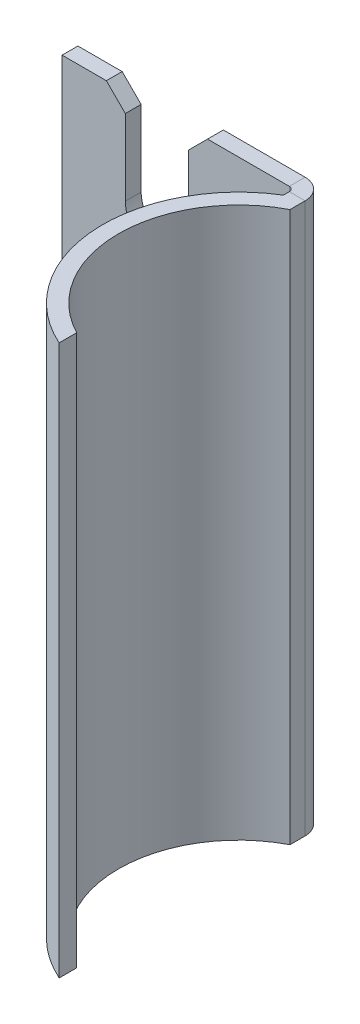
ISO-10303-21;
HEADER;
FILE_DESCRIPTION(('STEP AP214'),'2;1');
FILE_NAME('part.step','',(''),(''),'','','');
FILE_SCHEMA(('AUTOMOTIVE_DESIGN { 1 0 10303 214 1 1 1 1 }'));
ENDSEC;
DATA;
#1=APPLICATION_CONTEXT('core data for automotive mechanical design processes');
#2=APPLICATION_PROTOCOL_DEFINITION('international standard','automotive_design',2000,#1);
#3=PRODUCT_CONTEXT('',#1,'mechanical');
#4=PRODUCT('Part','Part','',(#3));
#5=PRODUCT_RELATED_PRODUCT_CATEGORY('part','',(#4));
#6=PRODUCT_DEFINITION_FORMATION('','',#4);
#7=PRODUCT_DEFINITION_CONTEXT('part definition',#1,'design');
#8=PRODUCT_DEFINITION('design','',#6,#7);
#9=PRODUCT_DEFINITION_SHAPE('','',#8);
#10=(LENGTH_UNIT() NAMED_UNIT(*) SI_UNIT(.MILLI.,.METRE.));
#11=(NAMED_UNIT(*) PLANE_ANGLE_UNIT() SI_UNIT($,.RADIAN.));
#12=(NAMED_UNIT(*) SI_UNIT($,.STERADIAN.) SOLID_ANGLE_UNIT());
#13=UNCERTAINTY_MEASURE_WITH_UNIT(LENGTH_MEASURE(1.E-05),#10,'distance_accuracy_value','');
#14=(GEOMETRIC_REPRESENTATION_CONTEXT(3) GLOBAL_UNCERTAINTY_ASSIGNED_CONTEXT((#13)) GLOBAL_UNIT_ASSIGNED_CONTEXT((#10,
#11,#12)) REPRESENTATION_CONTEXT('',''));
#15=CARTESIAN_POINT('',(0.,0.,0.));
#16=DIRECTION('',(0.,0.,1.));
#17=DIRECTION('',(1.,0.,0.));
#18=AXIS2_PLACEMENT_3D('',#15,#16,#17);
#19=CARTESIAN_POINT('',(39.1763280085947,-14.9999999948911,-23.3236719914054));
#20=DIRECTION('',(-1.,0.,0.));
#21=DIRECTION('',(0.,0.,1.));
#22=AXIS2_PLACEMENT_3D('',#19,#20,#21);
#23=PLANE('',#22);
#24=DIRECTION('',(0.,0.,1.));
#25=VECTOR('',#24,1.);
#26=CARTESIAN_POINT('',(39.1763280085948,-87.,-38.3236719914054));
#27=LINE('',#26,#25);
#28=CARTESIAN_POINT('',(39.1763280085946,-87.,0.736600000000011));
#29=VERTEX_POINT('',#28);
#30=CARTESIAN_POINT('',(39.1763280085946,-87.,3.13312362555544));
#31=VERTEX_POINT('',#30);
#32=EDGE_CURVE('E220',#29,#31,#27,.T.);
#33=ORIENTED_EDGE('',*,*,#32,.F.);
#34=DIRECTION('',(0.,1.,0.));
#35=VECTOR('',#34,1.);
#36=CARTESIAN_POINT('',(39.1763280085946,-14.9999999948911,0.736600000000018));
#37=LINE('',#36,#35);
#38=CARTESIAN_POINT('',(39.1763280085946,0.,0.736600000000041));
#39=VERTEX_POINT('',#38);
#40=EDGE_CURVE('E372',#29,#39,#37,.T.);
#41=ORIENTED_EDGE('',*,*,#40,.T.);
#42=DIRECTION('',(0.,0.,-1.));
#43=VECTOR('',#42,1.);
#44=CARTESIAN_POINT('',(39.1763280085947,0.,-18.3236719914054));
#45=LINE('',#44,#43);
#46=CARTESIAN_POINT('',(39.1763280085946,0.,3.13312362555544));
#47=VERTEX_POINT('',#46);
#48=EDGE_CURVE('E376',#47,#39,#45,.T.);
#49=ORIENTED_EDGE('',*,*,#48,.F.);
#50=DIRECTION('',(0.,1.,0.));
#51=VECTOR('',#50,1.);
#52=CARTESIAN_POINT('',(39.1763280085946,-127.04877857949,3.13312362555544));
#53=LINE('',#52,#51);
#54=EDGE_CURVE('E224',#31,#47,#53,.T.);
#55=ORIENTED_EDGE('',*,*,#54,.F.);
#56=EDGE_LOOP('',(#33,#41,#49,#55));
#57=FACE_BOUND('',#56,.T.);
#58=ADVANCED_FACE('F41',(#57),#23,.F.);
#59=CARTESIAN_POINT('',(39.1763280085947,0.,-18.3236719914054));
#60=DIRECTION('',(0.,1.,0.));
#61=DIRECTION('',(0.,0.,-1.));
#62=AXIS2_PLACEMENT_3D('',#59,#60,#61);
#63=PLANE('',#62);
#64=DIRECTION('',(1.,0.,0.));
#65=VECTOR('',#64,1.);
#66=CARTESIAN_POINT('',(39.1763280085946,0.,0.736600000000011));
#67=LINE('',#66,#65);
#68=CARTESIAN_POINT('',(36.6763280085946,0.,0.736600000000018));
#69=VERTEX_POINT('',#68);
#70=EDGE_CURVE('E382',#69,#39,#67,.T.);
#71=ORIENTED_EDGE('',*,*,#70,.F.);
#72=DIRECTION('',(0.,0.,-1.));
#73=VECTOR('',#72,1.);
#74=CARTESIAN_POINT('',(36.6763280085947,0.,-18.3236719914054));
#75=LINE('',#74,#73);
#76=CARTESIAN_POINT('',(36.6763280085946,0.,1.67632800859462));
#77=VERTEX_POINT('',#76);
#78=EDGE_CURVE('E371',#77,#69,#75,.T.);
#79=ORIENTED_EDGE('',*,*,#78,.F.);
#80=CARTESIAN_POINT('',(47.923240685031,0.,20.));
#81=DIRECTION('',(0.,1.,0.));
#82=DIRECTION('',(-1.,0.,0.));
#83=AXIS2_PLACEMENT_3D('',#80,#81,#82);
#84=CIRCLE('',#83,21.5);
#85=CARTESIAN_POINT('',(39.1763280085946,0.,39.6403034251204));
#86=VERTEX_POINT('',#85);
#87=EDGE_CURVE('E243',#77,#86,#84,.T.);
#88=ORIENTED_EDGE('',*,*,#87,.T.);
#89=DIRECTION('',(0.,0.,-1.));
#90=VECTOR('',#89,1.);
#91=CARTESIAN_POINT('',(39.1763280085946,0.,39.6403034251204));
#92=LINE('',#91,#90);
#93=CARTESIAN_POINT('',(39.1763280085946,0.,36.8668763744446));
#94=VERTEX_POINT('',#93);
#95=EDGE_CURVE('E239',#86,#94,#92,.T.);
#96=ORIENTED_EDGE('',*,*,#95,.T.);
#97=CARTESIAN_POINT('',(47.923240685031,0.,20.));
#98=DIRECTION('',(0.,-1.,0.));
#99=DIRECTION('',(-1.,0.,0.));
#100=AXIS2_PLACEMENT_3D('',#97,#98,#99);
#101=CIRCLE('',#100,19.);
#102=EDGE_CURVE('E230',#94,#47,#101,.T.);
#103=ORIENTED_EDGE('',*,*,#102,.T.);
#104=ORIENTED_EDGE('',*,*,#48,.T.);
#105=EDGE_LOOP('',(#71,#79,#88,#96,#103,#104));
#106=FACE_BOUND('',#105,.T.);
#107=ADVANCED_FACE('F486',(#106),#63,.T.);
#108=CARTESIAN_POINT('',(39.1763280085948,-87.,-38.3236719914054));
#109=DIRECTION('',(0.,-1.,0.));
#110=DIRECTION('',(1.,0.,0.));
#111=AXIS2_PLACEMENT_3D('',#108,#109,#110);
#112=PLANE('',#111);
#113=DIRECTION('',(-1.,0.,0.));
#114=VECTOR('',#113,1.);
#115=CARTESIAN_POINT('',(39.1763280085946,-87.,0.736600000000011));
#116=LINE('',#115,#114);
#117=CARTESIAN_POINT('',(36.6763280085946,-87.,0.736600000000004));
#118=VERTEX_POINT('',#117);
#119=EDGE_CURVE('E375',#29,#118,#116,.T.);
#120=ORIENTED_EDGE('',*,*,#119,.F.);
#121=ORIENTED_EDGE('',*,*,#32,.T.);
#122=CARTESIAN_POINT('',(47.923240685031,-87.,20.));
#123=DIRECTION('',(0.,-1.,0.));
#124=DIRECTION('',(0.,0.,-1.));
#125=AXIS2_PLACEMENT_3D('',#122,#123,#124);
#126=CIRCLE('',#125,19.);
#127=CARTESIAN_POINT('',(39.1763280085946,-87.,36.8668763744446));
#128=VERTEX_POINT('',#127);
#129=EDGE_CURVE('E212',#128,#31,#126,.T.);
#130=ORIENTED_EDGE('',*,*,#129,.F.);
#131=DIRECTION('',(0.,0.,-1.));
#132=VECTOR('',#131,1.);
#133=CARTESIAN_POINT('',(39.1763280085946,-87.,39.6403034251204));
#134=LINE('',#133,#132);
#135=CARTESIAN_POINT('',(39.1763280085946,-87.,39.6403034251204));
#136=VERTEX_POINT('',#135);
#137=EDGE_CURVE('E218',#136,#128,#134,.T.);
#138=ORIENTED_EDGE('',*,*,#137,.F.);
#139=CARTESIAN_POINT('',(47.923240685031,-87.,20.));
#140=DIRECTION('',(0.,-1.,0.));
#141=DIRECTION('',(0.,0.,-1.));
#142=AXIS2_PLACEMENT_3D('',#139,#140,#141);
#143=CIRCLE('',#142,21.5);
#144=CARTESIAN_POINT('',(36.6763280085946,-87.,1.67632800859462));
#145=VERTEX_POINT('',#144);
#146=EDGE_CURVE('E245',#145,#136,#143,.F.);
#147=ORIENTED_EDGE('',*,*,#146,.F.);
#148=DIRECTION('',(0.,0.,1.));
#149=VECTOR('',#148,1.);
#150=CARTESIAN_POINT('',(36.6763280085948,-87.,-38.3236719914054));
#151=LINE('',#150,#149);
#152=EDGE_CURVE('E264',#118,#145,#151,.T.);
#153=ORIENTED_EDGE('',*,*,#152,.F.);
#154=EDGE_LOOP('',(#120,#121,#130,#138,#147,#153));
#155=FACE_BOUND('',#154,.T.);
#156=ADVANCED_FACE('F215',(#155),#112,.T.);
#157=CARTESIAN_POINT('',(36.6763280085947,-14.9999999948911,-23.3236719914054));
#158=DIRECTION('',(-1.,0.,0.));
#159=DIRECTION('',(0.,0.,1.));
#160=AXIS2_PLACEMENT_3D('',#157,#158,#159);
#161=PLANE('',#160);
#162=DIRECTION('',(0.,1.,0.));
#163=VECTOR('',#162,1.);
#164=CARTESIAN_POINT('',(36.6763280085946,-14.9999999948911,0.736600000000011));
#165=LINE('',#164,#163);
#166=EDGE_CURVE('E379',#118,#69,#165,.T.);
#167=ORIENTED_EDGE('',*,*,#166,.F.);
#168=ORIENTED_EDGE('',*,*,#152,.T.);
#169=DIRECTION('',(0.,1.,0.));
#170=VECTOR('',#169,1.);
#171=CARTESIAN_POINT('',(36.6763280085946,0.,1.67632800859462));
#172=LINE('',#171,#170);
#173=EDGE_CURVE('E369',#145,#77,#172,.T.);
#174=ORIENTED_EDGE('',*,*,#173,.T.);
#175=ORIENTED_EDGE('',*,*,#78,.T.);
#176=EDGE_LOOP('',(#167,#168,#174,#175));
#177=FACE_BOUND('',#176,.T.);
#178=ADVANCED_FACE('F477',(#177),#161,.T.);
#179=CARTESIAN_POINT('',(20.,0.,-2.5));
#180=DIRECTION('',(-1.,0.,0.));
#181=DIRECTION('',(0.,-1.,0.));
#182=AXIS2_PLACEMENT_3D('',#179,#180,#181);
#183=PLANE('',#182);
#184=DIRECTION('',(0.,-1.,0.));
#185=VECTOR('',#184,1.);
#186=CARTESIAN_POINT('',(20.,0.,0.));
#187=LINE('',#186,#185);
#188=CARTESIAN_POINT('',(20.,-3.00000000000002,0.));
#189=VERTEX_POINT('',#188);
#190=CARTESIAN_POINT('',(20.,-15.,0.));
#191=VERTEX_POINT('',#190);
#192=EDGE_CURVE('E297',#189,#191,#187,.T.);
#193=ORIENTED_EDGE('',*,*,#192,.F.);
#194=DIRECTION('',(0.,0.,-1.));
#195=VECTOR('',#194,1.);
#196=CARTESIAN_POINT('',(20.,-3.00000000000002,-2.5));
#197=LINE('',#196,#195);
#198=CARTESIAN_POINT('',(20.,-3.00000000000002,-2.5));
#199=VERTEX_POINT('',#198);
#200=EDGE_CURVE('E404',#189,#199,#197,.T.);
#201=ORIENTED_EDGE('',*,*,#200,.T.);
#202=DIRECTION('',(0.,-1.,0.));
#203=VECTOR('',#202,1.);
#204=CARTESIAN_POINT('',(20.,0.,-2.5));
#205=LINE('',#204,#203);
#206=CARTESIAN_POINT('',(20.,-15.,-2.5));
#207=VERTEX_POINT('',#206);
#208=EDGE_CURVE('E366',#199,#207,#205,.T.);
#209=ORIENTED_EDGE('',*,*,#208,.T.);
#210=DIRECTION('',(0.,0.,1.));
#211=VECTOR('',#210,1.);
#212=CARTESIAN_POINT('',(20.,-15.,-2.5));
#213=LINE('',#212,#211);
#214=EDGE_CURVE('E363',#207,#191,#213,.T.);
#215=ORIENTED_EDGE('',*,*,#214,.T.);
#216=EDGE_LOOP('',(#193,#201,#209,#215));
#217=FACE_BOUND('',#216,.T.);
#218=ADVANCED_FACE('F500',(#217),#183,.T.);
#219=CARTESIAN_POINT('',(15.,-14.9999999948911,-2.5));
#220=DIRECTION('',(0.,0.,1.));
#221=DIRECTION('',(1.,0.,0.));
#222=AXIS2_PLACEMENT_3D('',#219,#220,#221);
#223=CYLINDRICAL_SURFACE('',#222,5.);
#224=CARTESIAN_POINT('',(15.,-14.9999999948911,0.));
#225=DIRECTION('',(0.,0.,-1.));
#226=DIRECTION('',(1.,0.,0.));
#227=AXIS2_PLACEMENT_3D('',#224,#225,#226);
#228=CIRCLE('',#227,5.);
#229=CARTESIAN_POINT('',(10.,-15.,0.));
#230=VERTEX_POINT('',#229);
#231=EDGE_CURVE('E294',#191,#230,#228,.T.);
#232=ORIENTED_EDGE('',*,*,#231,.F.);
#233=ORIENTED_EDGE('',*,*,#214,.F.);
#234=CARTESIAN_POINT('',(15.,-14.9999999948911,-2.5));
#235=DIRECTION('',(0.,0.,-1.));
#236=DIRECTION('',(1.,0.,0.));
#237=AXIS2_PLACEMENT_3D('',#234,#235,#236);
#238=CIRCLE('',#237,5.);
#239=CARTESIAN_POINT('',(10.,-15.,-2.5));
#240=VERTEX_POINT('',#239);
#241=EDGE_CURVE('E360',#207,#240,#238,.T.);
#242=ORIENTED_EDGE('',*,*,#241,.T.);
#243=DIRECTION('',(0.,0.,1.));
#244=VECTOR('',#243,1.);
#245=CARTESIAN_POINT('',(10.,-15.,-2.5));
#246=LINE('',#245,#244);
#247=EDGE_CURVE('E358',#240,#230,#246,.T.);
#248=ORIENTED_EDGE('',*,*,#247,.T.);
#249=EDGE_LOOP('',(#232,#233,#242,#248));
#250=FACE_BOUND('',#249,.T.);
#251=ADVANCED_FACE('F554',(#250),#223,.F.);
#252=CARTESIAN_POINT('',(9.99999999999999,0.,-2.5));
#253=DIRECTION('',(1.,0.,0.));
#254=DIRECTION('',(0.,0.,-1.));
#255=AXIS2_PLACEMENT_3D('',#252,#253,#254);
#256=PLANE('',#255);
#257=DIRECTION('',(0.,1.,0.));
#258=VECTOR('',#257,1.);
#259=CARTESIAN_POINT('',(9.99999999999999,0.,-2.5));
#260=LINE('',#259,#258);
#261=CARTESIAN_POINT('',(9.99999999999999,-3.,-2.5));
#262=VERTEX_POINT('',#261);
#263=EDGE_CURVE('E355',#240,#262,#260,.T.);
#264=ORIENTED_EDGE('',*,*,#263,.T.);
#265=DIRECTION('',(0.,0.,1.));
#266=VECTOR('',#265,1.);
#267=CARTESIAN_POINT('',(9.99999999999999,-3.,-2.5));
#268=LINE('',#267,#266);
#269=CARTESIAN_POINT('',(9.99999999999999,-3.,0.));
#270=VERTEX_POINT('',#269);
#271=EDGE_CURVE('E410',#262,#270,#268,.T.);
#272=ORIENTED_EDGE('',*,*,#271,.T.);
#273=DIRECTION('',(0.,1.,0.));
#274=VECTOR('',#273,1.);
#275=CARTESIAN_POINT('',(9.99999999999999,0.,0.));
#276=LINE('',#275,#274);
#277=EDGE_CURVE('E291',#230,#270,#276,.T.);
#278=ORIENTED_EDGE('',*,*,#277,.F.);
#279=ORIENTED_EDGE('',*,*,#247,.F.);
#280=EDGE_LOOP('',(#264,#272,#278,#279));
#281=FACE_BOUND('',#280,.T.);
#282=ADVANCED_FACE('F549',(#281),#256,.T.);
#283=CARTESIAN_POINT('',(0.,0.,-2.5));
#284=DIRECTION('',(0.,1.,0.));
#285=DIRECTION('',(-1.,0.,0.));
#286=AXIS2_PLACEMENT_3D('',#283,#284,#285);
#287=PLANE('',#286);
#288=DIRECTION('',(-1.,0.,0.));
#289=VECTOR('',#288,1.);
#290=CARTESIAN_POINT('',(0.,0.,0.));
#291=LINE('',#290,#289);
#292=CARTESIAN_POINT('',(6.99999999999998,0.,0.));
#293=VERTEX_POINT('',#292);
#294=CARTESIAN_POINT('',(0.,0.,0.));
#295=VERTEX_POINT('',#294);
#296=EDGE_CURVE('E289',#293,#295,#291,.T.);
#297=ORIENTED_EDGE('',*,*,#296,.F.);
#298=DIRECTION('',(0.,0.,-1.));
#299=VECTOR('',#298,1.);
#300=CARTESIAN_POINT('',(6.99999999999998,0.,-2.5));
#301=LINE('',#300,#299);
#302=CARTESIAN_POINT('',(6.99999999999998,0.,-2.5));
#303=VERTEX_POINT('',#302);
#304=EDGE_CURVE('E413',#293,#303,#301,.T.);
#305=ORIENTED_EDGE('',*,*,#304,.T.);
#306=DIRECTION('',(-1.,0.,0.));
#307=VECTOR('',#306,1.);
#308=CARTESIAN_POINT('',(0.,0.,-2.5));
#309=LINE('',#308,#307);
#310=CARTESIAN_POINT('',(0.,0.,-2.5));
#311=VERTEX_POINT('',#310);
#312=EDGE_CURVE('E353',#303,#311,#309,.T.);
#313=ORIENTED_EDGE('',*,*,#312,.T.);
#314=DIRECTION('',(0.,0.,1.));
#315=VECTOR('',#314,1.);
#316=CARTESIAN_POINT('',(0.,0.,-2.5));
#317=LINE('',#316,#315);
#318=EDGE_CURVE('E350',#311,#295,#317,.T.);
#319=ORIENTED_EDGE('',*,*,#318,.T.);
#320=EDGE_LOOP('',(#297,#305,#313,#319));
#321=FACE_BOUND('',#320,.T.);
#322=ADVANCED_FACE('F542',(#321),#287,.T.);
#323=CARTESIAN_POINT('',(0.,0.,-2.5));
#324=DIRECTION('',(-1.,0.,0.));
#325=DIRECTION('',(0.,0.,1.));
#326=AXIS2_PLACEMENT_3D('',#323,#324,#325);
#327=PLANE('',#326);
#328=DIRECTION('',(0.,-1.,0.));
#329=VECTOR('',#328,1.);
#330=CARTESIAN_POINT('',(0.,0.,-2.5));
#331=LINE('',#330,#329);
#332=CARTESIAN_POINT('',(0.,-35.,-2.5));
#333=VERTEX_POINT('',#332);
#334=EDGE_CURVE('E347',#311,#333,#331,.T.);
#335=ORIENTED_EDGE('',*,*,#334,.T.);
#336=DIRECTION('',(0.,0.,1.));
#337=VECTOR('',#336,1.);
#338=CARTESIAN_POINT('',(0.,-35.,-2.5));
#339=LINE('',#338,#337);
#340=CARTESIAN_POINT('',(0.,-35.,0.));
#341=VERTEX_POINT('',#340);
#342=EDGE_CURVE('E385',#333,#341,#339,.T.);
#343=ORIENTED_EDGE('',*,*,#342,.T.);
#344=DIRECTION('',(0.,-1.,0.));
#345=VECTOR('',#344,1.);
#346=CARTESIAN_POINT('',(0.,0.,0.));
#347=LINE('',#346,#345);
#348=EDGE_CURVE('E286',#295,#341,#347,.T.);
#349=ORIENTED_EDGE('',*,*,#348,.F.);
#350=ORIENTED_EDGE('',*,*,#318,.F.);
#351=EDGE_LOOP('',(#335,#343,#349,#350));
#352=FACE_BOUND('',#351,.T.);
#353=ADVANCED_FACE('F537',(#352),#327,.T.);
#354=CARTESIAN_POINT('',(15.,-40.,-2.5));
#355=DIRECTION('',(0.,-1.,0.));
#356=DIRECTION('',(0.,0.,-1.));
#357=AXIS2_PLACEMENT_3D('',#354,#355,#356);
#358=PLANE('',#357);
#359=DIRECTION('',(1.,0.,0.));
#360=VECTOR('',#359,1.);
#361=CARTESIAN_POINT('',(15.,-40.,0.));
#362=LINE('',#361,#360);
#363=CARTESIAN_POINT('',(7.07106781186548,-40.,0.));
#364=VERTEX_POINT('',#363);
#365=CARTESIAN_POINT('',(15.,-40.,0.));
#366=VERTEX_POINT('',#365);
#367=EDGE_CURVE('E284',#364,#366,#362,.T.);
#368=ORIENTED_EDGE('',*,*,#367,.F.);
#369=DIRECTION('',(0.,0.,1.));
#370=VECTOR('',#369,1.);
#371=CARTESIAN_POINT('',(7.07106781186548,-40.,-2.5));
#372=LINE('',#371,#370);
#373=CARTESIAN_POINT('',(7.07106781186548,-40.,-2.5));
#374=VERTEX_POINT('',#373);
#375=EDGE_CURVE('E415',#364,#374,#372,.F.);
#376=ORIENTED_EDGE('',*,*,#375,.T.);
#377=DIRECTION('',(1.,0.,0.));
#378=VECTOR('',#377,1.);
#379=CARTESIAN_POINT('',(15.,-40.,-2.5));
#380=LINE('',#379,#378);
#381=CARTESIAN_POINT('',(15.,-40.,-2.5));
#382=VERTEX_POINT('',#381);
#383=EDGE_CURVE('E345',#374,#382,#380,.T.);
#384=ORIENTED_EDGE('',*,*,#383,.T.);
#385=DIRECTION('',(0.,0.,1.));
#386=VECTOR('',#385,1.);
#387=CARTESIAN_POINT('',(15.,-40.,-2.5));
#388=LINE('',#387,#386);
#389=EDGE_CURVE('E342',#382,#366,#388,.T.);
#390=ORIENTED_EDGE('',*,*,#389,.T.);
#391=EDGE_LOOP('',(#368,#376,#384,#390));
#392=FACE_BOUND('',#391,.T.);
#393=ADVANCED_FACE('F524',(#392),#358,.T.);
#394=CARTESIAN_POINT('',(15.,-45.,-2.5));
#395=DIRECTION('',(0.,0.,1.));
#396=DIRECTION('',(1.,0.,0.));
#397=AXIS2_PLACEMENT_3D('',#394,#395,#396);
#398=CYLINDRICAL_SURFACE('',#397,5.);
#399=CARTESIAN_POINT('',(15.,-45.,0.));
#400=DIRECTION('',(0.,0.,-1.));
#401=DIRECTION('',(1.,0.,0.));
#402=AXIS2_PLACEMENT_3D('',#399,#400,#401);
#403=CIRCLE('',#402,5.);
#404=CARTESIAN_POINT('',(20.,-45.,0.));
#405=VERTEX_POINT('',#404);
#406=EDGE_CURVE('E281',#366,#405,#403,.T.);
#407=ORIENTED_EDGE('',*,*,#406,.F.);
#408=ORIENTED_EDGE('',*,*,#389,.F.);
#409=CARTESIAN_POINT('',(15.,-45.,-2.5));
#410=DIRECTION('',(0.,0.,-1.));
#411=DIRECTION('',(1.,0.,0.));
#412=AXIS2_PLACEMENT_3D('',#409,#410,#411);
#413=CIRCLE('',#412,5.);
#414=CARTESIAN_POINT('',(20.,-45.,-2.5));
#415=VERTEX_POINT('',#414);
#416=EDGE_CURVE('E339',#382,#415,#413,.T.);
#417=ORIENTED_EDGE('',*,*,#416,.T.);
#418=DIRECTION('',(0.,0.,1.));
#419=VECTOR('',#418,1.);
#420=CARTESIAN_POINT('',(20.,-45.,-2.5));
#421=LINE('',#420,#419);
#422=EDGE_CURVE('E337',#415,#405,#421,.T.);
#423=ORIENTED_EDGE('',*,*,#422,.T.);
#424=EDGE_LOOP('',(#407,#408,#417,#423));
#425=FACE_BOUND('',#424,.T.);
#426=ADVANCED_FACE('F529',(#425),#398,.F.);
#427=CARTESIAN_POINT('',(20.,-45.,-2.5));
#428=DIRECTION('',(-1.,0.,0.));
#429=DIRECTION('',(0.,0.,1.));
#430=AXIS2_PLACEMENT_3D('',#427,#428,#429);
#431=PLANE('',#430);
#432=DIRECTION('',(0.,-1.,0.));
#433=VECTOR('',#432,1.);
#434=CARTESIAN_POINT('',(20.,-45.,0.));
#435=LINE('',#434,#433);
#436=CARTESIAN_POINT('',(20.,-70.,0.));
#437=VERTEX_POINT('',#436);
#438=EDGE_CURVE('E278',#405,#437,#435,.T.);
#439=ORIENTED_EDGE('',*,*,#438,.F.);
#440=ORIENTED_EDGE('',*,*,#422,.F.);
#441=DIRECTION('',(0.,-1.,0.));
#442=VECTOR('',#441,1.);
#443=CARTESIAN_POINT('',(20.,-45.,-2.5));
#444=LINE('',#443,#442);
#445=CARTESIAN_POINT('',(20.,-70.,-2.5));
#446=VERTEX_POINT('',#445);
#447=EDGE_CURVE('E334',#415,#446,#444,.T.);
#448=ORIENTED_EDGE('',*,*,#447,.T.);
#449=DIRECTION('',(0.,0.,1.));
#450=VECTOR('',#449,1.);
#451=CARTESIAN_POINT('',(20.,-70.,-2.5));
#452=LINE('',#451,#450);
#453=EDGE_CURVE('E332',#446,#437,#452,.T.);
#454=ORIENTED_EDGE('',*,*,#453,.T.);
#455=EDGE_LOOP('',(#439,#440,#448,#454));
#456=FACE_BOUND('',#455,.T.);
#457=ADVANCED_FACE('F531',(#456),#431,.T.);
#458=CARTESIAN_POINT('',(15.,-70.,-2.5));
#459=DIRECTION('',(0.,0.,1.));
#460=DIRECTION('',(1.,0.,0.));
#461=AXIS2_PLACEMENT_3D('',#458,#459,#460);
#462=CYLINDRICAL_SURFACE('',#461,5.);
#463=CARTESIAN_POINT('',(15.,-70.,0.));
#464=DIRECTION('',(0.,0.,-1.));
#465=DIRECTION('',(1.,0.,0.));
#466=AXIS2_PLACEMENT_3D('',#463,#464,#465);
#467=CIRCLE('',#466,5.);
#468=CARTESIAN_POINT('',(10.,-70.,0.));
#469=VERTEX_POINT('',#468);
#470=EDGE_CURVE('E275',#437,#469,#467,.T.);
#471=ORIENTED_EDGE('',*,*,#470,.F.);
#472=ORIENTED_EDGE('',*,*,#453,.F.);
#473=CARTESIAN_POINT('',(15.,-70.,-2.5));
#474=DIRECTION('',(0.,0.,-1.));
#475=DIRECTION('',(1.,0.,0.));
#476=AXIS2_PLACEMENT_3D('',#473,#474,#475);
#477=CIRCLE('',#476,5.);
#478=CARTESIAN_POINT('',(10.,-70.,-2.5));
#479=VERTEX_POINT('',#478);
#480=EDGE_CURVE('E329',#446,#479,#477,.T.);
#481=ORIENTED_EDGE('',*,*,#480,.T.);
#482=DIRECTION('',(0.,0.,1.));
#483=VECTOR('',#482,1.);
#484=CARTESIAN_POINT('',(10.,-70.,-2.5));
#485=LINE('',#484,#483);
#486=EDGE_CURVE('E327',#479,#469,#485,.T.);
#487=ORIENTED_EDGE('',*,*,#486,.T.);
#488=EDGE_LOOP('',(#471,#472,#481,#487));
#489=FACE_BOUND('',#488,.T.);
#490=ADVANCED_FACE('F435',(#489),#462,.F.);
#491=CARTESIAN_POINT('',(10.,-52.,-2.5));
#492=DIRECTION('',(1.,0.,0.));
#493=DIRECTION('',(0.,0.,-1.));
#494=AXIS2_PLACEMENT_3D('',#491,#492,#493);
#495=PLANE('',#494);
#496=DIRECTION('',(0.,1.,0.));
#497=VECTOR('',#496,1.);
#498=CARTESIAN_POINT('',(10.,-52.,-2.5));
#499=LINE('',#498,#497);
#500=CARTESIAN_POINT('',(10.,-57.,-2.5));
#501=VERTEX_POINT('',#500);
#502=EDGE_CURVE('E324',#479,#501,#499,.T.);
#503=ORIENTED_EDGE('',*,*,#502,.T.);
#504=DIRECTION('',(0.,0.,1.));
#505=VECTOR('',#504,1.);
#506=CARTESIAN_POINT('',(10.,-57.,-2.5));
#507=LINE('',#506,#505);
#508=CARTESIAN_POINT('',(10.,-57.,0.));
#509=VERTEX_POINT('',#508);
#510=EDGE_CURVE('E49',#501,#509,#507,.T.);
#511=ORIENTED_EDGE('',*,*,#510,.T.);
#512=DIRECTION('',(0.,1.,0.));
#513=VECTOR('',#512,1.);
#514=CARTESIAN_POINT('',(10.,-52.,0.));
#515=LINE('',#514,#513);
#516=EDGE_CURVE('E273',#469,#509,#515,.T.);
#517=ORIENTED_EDGE('',*,*,#516,.F.);
#518=ORIENTED_EDGE('',*,*,#486,.F.);
#519=EDGE_LOOP('',(#503,#511,#517,#518));
#520=FACE_BOUND('',#519,.T.);
#521=ADVANCED_FACE('F428',(#520),#495,.T.);
#522=CARTESIAN_POINT('',(0.,-52.,-2.5));
#523=DIRECTION('',(0.,1.,0.));
#524=DIRECTION('',(-1.,0.,0.));
#525=AXIS2_PLACEMENT_3D('',#522,#523,#524);
#526=PLANE('',#525);
#527=DIRECTION('',(-1.,0.,0.));
#528=VECTOR('',#527,1.);
#529=CARTESIAN_POINT('',(0.,-52.,0.));
#530=LINE('',#529,#528);
#531=CARTESIAN_POINT('',(5.,-52.,0.));
#532=VERTEX_POINT('',#531);
#533=CARTESIAN_POINT('',(0.,-52.,0.));
#534=VERTEX_POINT('',#533);
#535=EDGE_CURVE('E271',#532,#534,#530,.T.);
#536=ORIENTED_EDGE('',*,*,#535,.F.);
#537=DIRECTION('',(0.,0.,1.));
#538=VECTOR('',#537,1.);
#539=CARTESIAN_POINT('',(5.,-52.,-2.5));
#540=LINE('',#539,#538);
#541=CARTESIAN_POINT('',(5.,-52.,-2.5));
#542=VERTEX_POINT('',#541);
#543=EDGE_CURVE('E12',#532,#542,#540,.F.);
#544=ORIENTED_EDGE('',*,*,#543,.T.);
#545=DIRECTION('',(-1.,0.,0.));
#546=VECTOR('',#545,1.);
#547=CARTESIAN_POINT('',(0.,-52.,-2.5));
#548=LINE('',#547,#546);
#549=CARTESIAN_POINT('',(0.,-52.,-2.5));
#550=VERTEX_POINT('',#549);
#551=EDGE_CURVE('E322',#542,#550,#548,.T.);
#552=ORIENTED_EDGE('',*,*,#551,.T.);
#553=DIRECTION('',(0.,0.,1.));
#554=VECTOR('',#553,1.);
#555=CARTESIAN_POINT('',(0.,-52.,-2.5));
#556=LINE('',#555,#554);
#557=EDGE_CURVE('E319',#550,#534,#556,.T.);
#558=ORIENTED_EDGE('',*,*,#557,.T.);
#559=EDGE_LOOP('',(#536,#544,#552,#558));
#560=FACE_BOUND('',#559,.T.);
#561=ADVANCED_FACE('F444',(#560),#526,.T.);
#562=CARTESIAN_POINT('',(0.,-52.,-2.5));
#563=DIRECTION('',(-1.,0.,0.));
#564=DIRECTION('',(0.,0.,1.));
#565=AXIS2_PLACEMENT_3D('',#562,#563,#564);
#566=PLANE('',#565);
#567=DIRECTION('',(0.,-1.,0.));
#568=VECTOR('',#567,1.);
#569=CARTESIAN_POINT('',(0.,-52.,0.));
#570=LINE('',#569,#568);
#571=CARTESIAN_POINT('',(0.,-87.,0.));
#572=VERTEX_POINT('',#571);
#573=EDGE_CURVE('E268',#534,#572,#570,.T.);
#574=ORIENTED_EDGE('',*,*,#573,.F.);
#575=ORIENTED_EDGE('',*,*,#557,.F.);
#576=DIRECTION('',(0.,-1.,0.));
#577=VECTOR('',#576,1.);
#578=CARTESIAN_POINT('',(0.,-52.,-2.5));
#579=LINE('',#578,#577);
#580=CARTESIAN_POINT('',(0.,-87.,-2.5));
#581=VERTEX_POINT('',#580);
#582=EDGE_CURVE('E316',#550,#581,#579,.T.);
#583=ORIENTED_EDGE('',*,*,#582,.T.);
#584=DIRECTION('',(0.,0.,1.));
#585=VECTOR('',#584,1.);
#586=CARTESIAN_POINT('',(0.,-87.,-2.5));
#587=LINE('',#586,#585);
#588=EDGE_CURVE('E314',#581,#572,#587,.T.);
#589=ORIENTED_EDGE('',*,*,#588,.T.);
#590=EDGE_LOOP('',(#574,#575,#583,#589));
#591=FACE_BOUND('',#590,.T.);
#592=ADVANCED_FACE('F449',(#591),#566,.T.);
#593=CARTESIAN_POINT('',(15.,-14.9999999948911,-2.5));
#594=DIRECTION('',(0.,0.,1.));
#595=DIRECTION('',(1.,0.,0.));
#596=AXIS2_PLACEMENT_3D('',#593,#594,#595);
#597=PLANE('',#596);
#598=ORIENTED_EDGE('',*,*,#383,.F.);
#599=CARTESIAN_POINT('',(7.07106781186548,-35.,-2.5));
#600=DIRECTION('',(0.,0.,1.));
#601=DIRECTION('',(1.,0.,0.));
#602=AXIS2_PLACEMENT_3D('',#599,#600,#601);
#603=CIRCLE('',#602,5.);
#604=CARTESIAN_POINT('',(3.53553390593275,-38.5355339059327,-2.5));
#605=VERTEX_POINT('',#604);
#606=EDGE_CURVE('E420',#374,#605,#603,.F.);
#607=ORIENTED_EDGE('',*,*,#606,.T.);
#608=DIRECTION('',(0.707106781186549,-0.707106781186547,0.));
#609=VECTOR('',#608,1.);
#610=CARTESIAN_POINT('',(0.,-35.,-2.5));
#611=LINE('',#610,#609);
#612=EDGE_CURVE('E395',#605,#333,#611,.F.);
#613=ORIENTED_EDGE('',*,*,#612,.T.);
#614=ORIENTED_EDGE('',*,*,#334,.F.);
#615=ORIENTED_EDGE('',*,*,#312,.F.);
#616=DIRECTION('',(-0.707106781186549,0.707106781186546,0.));
#617=VECTOR('',#616,1.);
#618=CARTESIAN_POINT('',(9.99999999999999,-3.,-2.5));
#619=LINE('',#618,#617);
#620=EDGE_CURVE('E406',#303,#262,#619,.F.);
#621=ORIENTED_EDGE('',*,*,#620,.T.);
#622=ORIENTED_EDGE('',*,*,#263,.F.);
#623=ORIENTED_EDGE('',*,*,#241,.F.);
#624=ORIENTED_EDGE('',*,*,#208,.F.);
#625=DIRECTION('',(-0.707106781186546,-0.707106781186549,0.));
#626=VECTOR('',#625,1.);
#627=CARTESIAN_POINT('',(23.,0.,-2.5));
#628=LINE('',#627,#626);
#629=CARTESIAN_POINT('',(23.,0.,-2.5));
#630=VERTEX_POINT('',#629);
#631=EDGE_CURVE('E408',#199,#630,#628,.F.);
#632=ORIENTED_EDGE('',*,*,#631,.T.);
#633=DIRECTION('',(-1.,0.,0.));
#634=VECTOR('',#633,1.);
#635=CARTESIAN_POINT('',(20.,0.,-2.5));
#636=LINE('',#635,#634);
#637=CARTESIAN_POINT('',(35.9397280085946,0.,-2.5));
#638=VERTEX_POINT('',#637);
#639=EDGE_CURVE('E261',#638,#630,#636,.T.);
#640=ORIENTED_EDGE('',*,*,#639,.F.);
#641=DIRECTION('',(0.,1.,0.));
#642=VECTOR('',#641,1.);
#643=CARTESIAN_POINT('',(35.9397280085946,-14.9999999948911,-2.5));
#644=LINE('',#643,#642);
#645=CARTESIAN_POINT('',(35.9397280085946,-87.,-2.5));
#646=VERTEX_POINT('',#645);
#647=EDGE_CURVE('E257',#646,#638,#644,.T.);
#648=ORIENTED_EDGE('',*,*,#647,.F.);
#649=DIRECTION('',(1.,0.,0.));
#650=VECTOR('',#649,1.);
#651=CARTESIAN_POINT('',(0.,-87.,-2.5));
#652=LINE('',#651,#650);
#653=EDGE_CURVE('E311',#581,#646,#652,.T.);
#654=ORIENTED_EDGE('',*,*,#653,.F.);
#655=ORIENTED_EDGE('',*,*,#582,.F.);
#656=ORIENTED_EDGE('',*,*,#551,.F.);
#657=CARTESIAN_POINT('',(5.,-57.,-2.5));
#658=DIRECTION('',(0.,0.,1.));
#659=DIRECTION('',(1.,0.,0.));
#660=AXIS2_PLACEMENT_3D('',#657,#658,#659);
#661=CIRCLE('',#660,5.);
#662=EDGE_CURVE('E418',#542,#501,#661,.F.);
#663=ORIENTED_EDGE('',*,*,#662,.T.);
#664=ORIENTED_EDGE('',*,*,#502,.F.);
#665=ORIENTED_EDGE('',*,*,#480,.F.);
#666=ORIENTED_EDGE('',*,*,#447,.F.);
#667=ORIENTED_EDGE('',*,*,#416,.F.);
#668=EDGE_LOOP('',(#598,#607,#613,#614,#615,#621,#622,#623,#624,#632,#640,#648,#654,#655,#656,
#663,#664,#665,#666,#667));
#669=FACE_BOUND('',#668,.T.);
#670=ADVANCED_FACE('F439',(#669),#597,.F.);
#671=CARTESIAN_POINT('',(0.,-87.,-2.5));
#672=DIRECTION('',(0.,-1.,0.));
#673=DIRECTION('',(0.,0.,-1.));
#674=AXIS2_PLACEMENT_3D('',#671,#672,#673);
#675=PLANE('',#674);
#676=ORIENTED_EDGE('',*,*,#653,.T.);
#677=DIRECTION('',(0.,0.,1.));
#678=VECTOR('',#677,1.);
#679=CARTESIAN_POINT('',(35.9397280085946,-87.,-2.5));
#680=LINE('',#679,#678);
#681=CARTESIAN_POINT('',(35.9397280085946,-87.,0.));
#682=VERTEX_POINT('',#681);
#683=EDGE_CURVE('E308',#646,#682,#680,.T.);
#684=ORIENTED_EDGE('',*,*,#683,.T.);
#685=DIRECTION('',(1.,0.,0.));
#686=VECTOR('',#685,1.);
#687=CARTESIAN_POINT('',(0.,-87.,0.));
#688=LINE('',#687,#686);
#689=EDGE_CURVE('E305',#572,#682,#688,.T.);
#690=ORIENTED_EDGE('',*,*,#689,.F.);
#691=ORIENTED_EDGE('',*,*,#588,.F.);
#692=EDGE_LOOP('',(#676,#684,#690,#691));
#693=FACE_BOUND('',#692,.T.);
#694=ADVANCED_FACE('F452',(#693),#675,.T.);
#695=CARTESIAN_POINT('',(15.,-14.9999999948911,0.));
#696=DIRECTION('',(0.,0.,1.));
#697=DIRECTION('',(1.,0.,0.));
#698=AXIS2_PLACEMENT_3D('',#695,#696,#697);
#699=PLANE('',#698);
#700=DIRECTION('',(-0.707106781186549,0.707106781186547,0.));
#701=VECTOR('',#700,1.);
#702=CARTESIAN_POINT('',(-2.50000000255443,-32.4999999974456,0.));
#703=LINE('',#702,#701);
#704=CARTESIAN_POINT('',(3.53553390593275,-38.5355339059327,0.));
#705=VERTEX_POINT('',#704);
#706=EDGE_CURVE('E392',#341,#705,#703,.F.);
#707=ORIENTED_EDGE('',*,*,#706,.T.);
#708=CARTESIAN_POINT('',(7.07106781186548,-35.,0.));
#709=DIRECTION('',(0.,0.,1.));
#710=DIRECTION('',(1.,0.,0.));
#711=AXIS2_PLACEMENT_3D('',#708,#709,#710);
#712=CIRCLE('',#711,5.);
#713=EDGE_CURVE('E425',#705,#364,#712,.T.);
#714=ORIENTED_EDGE('',*,*,#713,.T.);
#715=ORIENTED_EDGE('',*,*,#367,.T.);
#716=ORIENTED_EDGE('',*,*,#406,.T.);
#717=ORIENTED_EDGE('',*,*,#438,.T.);
#718=ORIENTED_EDGE('',*,*,#470,.T.);
#719=ORIENTED_EDGE('',*,*,#516,.T.);
#720=CARTESIAN_POINT('',(5.,-57.,0.));
#721=DIRECTION('',(0.,0.,1.));
#722=DIRECTION('',(1.,0.,0.));
#723=AXIS2_PLACEMENT_3D('',#720,#721,#722);
#724=CIRCLE('',#723,5.);
#725=EDGE_CURVE('E56',#509,#532,#724,.T.);
#726=ORIENTED_EDGE('',*,*,#725,.T.);
#727=ORIENTED_EDGE('',*,*,#535,.T.);
#728=ORIENTED_EDGE('',*,*,#573,.T.);
#729=ORIENTED_EDGE('',*,*,#689,.T.);
#730=DIRECTION('',(0.,1.,0.));
#731=VECTOR('',#730,1.);
#732=CARTESIAN_POINT('',(35.9397280085946,-14.9999999948911,0.));
#733=LINE('',#732,#731);
#734=CARTESIAN_POINT('',(35.9397280085946,0.,0.));
#735=VERTEX_POINT('',#734);
#736=EDGE_CURVE('E302',#682,#735,#733,.T.);
#737=ORIENTED_EDGE('',*,*,#736,.T.);
#738=DIRECTION('',(-1.,0.,0.));
#739=VECTOR('',#738,1.);
#740=CARTESIAN_POINT('',(20.,0.,0.));
#741=LINE('',#740,#739);
#742=CARTESIAN_POINT('',(23.,0.,0.));
#743=VERTEX_POINT('',#742);
#744=EDGE_CURVE('E299',#735,#743,#741,.T.);
#745=ORIENTED_EDGE('',*,*,#744,.T.);
#746=DIRECTION('',(0.707106781186546,0.707106781186549,0.));
#747=VECTOR('',#746,1.);
#748=CARTESIAN_POINT('',(11.5000000025545,-11.4999999974456,0.));
#749=LINE('',#748,#747);
#750=EDGE_CURVE('E402',#743,#189,#749,.F.);
#751=ORIENTED_EDGE('',*,*,#750,.T.);
#752=ORIENTED_EDGE('',*,*,#192,.T.);
#753=ORIENTED_EDGE('',*,*,#231,.T.);
#754=ORIENTED_EDGE('',*,*,#277,.T.);
#755=DIRECTION('',(0.707106781186549,-0.707106781186546,0.));
#756=VECTOR('',#755,1.);
#757=CARTESIAN_POINT('',(18.4999999974455,-11.4999999974455,0.));
#758=LINE('',#757,#756);
#759=EDGE_CURVE('E400',#270,#293,#758,.F.);
#760=ORIENTED_EDGE('',*,*,#759,.T.);
#761=ORIENTED_EDGE('',*,*,#296,.T.);
#762=ORIENTED_EDGE('',*,*,#348,.T.);
#763=EDGE_LOOP('',(#707,#714,#715,#716,#717,#718,#719,#726,#727,#728,#729,#737,#745,#751,#752,
#753,#754,#760,#761,#762));
#764=FACE_BOUND('',#763,.T.);
#765=ADVANCED_FACE('F431',(#764),#699,.T.);
#766=CARTESIAN_POINT('',(20.,0.,-2.5));
#767=DIRECTION('',(0.,1.,0.));
#768=DIRECTION('',(-1.,0.,0.));
#769=AXIS2_PLACEMENT_3D('',#766,#767,#768);
#770=PLANE('',#769);
#771=ORIENTED_EDGE('',*,*,#639,.T.);
#772=DIRECTION('',(0.,0.,1.));
#773=VECTOR('',#772,1.);
#774=CARTESIAN_POINT('',(23.,0.,-2.5));
#775=LINE('',#774,#773);
#776=EDGE_CURVE('E397',#630,#743,#775,.T.);
#777=ORIENTED_EDGE('',*,*,#776,.T.);
#778=ORIENTED_EDGE('',*,*,#744,.F.);
#779=DIRECTION('',(0.,0.,-1.));
#780=VECTOR('',#779,1.);
#781=CARTESIAN_POINT('',(35.9397280085946,0.,-2.5));
#782=LINE('',#781,#780);
#783=EDGE_CURVE('E265',#735,#638,#782,.T.);
#784=ORIENTED_EDGE('',*,*,#783,.T.);
#785=EDGE_LOOP('',(#771,#777,#778,#784));
#786=FACE_BOUND('',#785,.T.);
#787=ADVANCED_FACE('F469',(#786),#770,.T.);
#788=CARTESIAN_POINT('',(35.9397280085946,-87.,0.7366));
#789=DIRECTION('',(0.,-1.,0.));
#790=DIRECTION('',(0.,0.,-1.));
#791=AXIS2_PLACEMENT_3D('',#788,#789,#790);
#792=PLANE('',#791);
#793=ORIENTED_EDGE('',*,*,#119,.T.);
#794=CARTESIAN_POINT('',(35.9397280085946,-86.9999999999999,0.7366));
#795=DIRECTION('',(0.,-1.,0.));
#796=DIRECTION('',(1.,0.,0.));
#797=AXIS2_PLACEMENT_3D('',#794,#795,#796);
#798=CIRCLE('',#797,0.7366);
#799=EDGE_CURVE('E249',#118,#682,#798,.F.);
#800=ORIENTED_EDGE('',*,*,#799,.T.);
#801=ORIENTED_EDGE('',*,*,#683,.F.);
#802=CARTESIAN_POINT('',(35.9397280085946,-87.,0.7366));
#803=DIRECTION('',(0.,1.,0.));
#804=DIRECTION('',(0.,0.,-1.));
#805=AXIS2_PLACEMENT_3D('',#802,#803,#804);
#806=CIRCLE('',#805,3.2366);
#807=EDGE_CURVE('E250',#29,#646,#806,.T.);
#808=ORIENTED_EDGE('',*,*,#807,.F.);
#809=EDGE_LOOP('',(#793,#800,#801,#808));
#810=FACE_BOUND('',#809,.T.);
#811=ADVANCED_FACE('F455',(#810),#792,.T.);
#812=CARTESIAN_POINT('',(35.9397280085946,0.,0.7366));
#813=DIRECTION('',(0.,1.,0.));
#814=DIRECTION('',(-1.,0.,0.));
#815=AXIS2_PLACEMENT_3D('',#812,#813,#814);
#816=PLANE('',#815);
#817=ORIENTED_EDGE('',*,*,#783,.F.);
#818=CARTESIAN_POINT('',(35.9397280085946,0.,0.7366));
#819=DIRECTION('',(0.,-1.,0.));
#820=DIRECTION('',(1.,0.,0.));
#821=AXIS2_PLACEMENT_3D('',#818,#819,#820);
#822=CIRCLE('',#821,0.7366);
#823=EDGE_CURVE('E254',#735,#69,#822,.T.);
#824=ORIENTED_EDGE('',*,*,#823,.T.);
#825=ORIENTED_EDGE('',*,*,#70,.T.);
#826=CARTESIAN_POINT('',(35.9397280085946,0.,0.7366));
#827=DIRECTION('',(0.,-1.,0.));
#828=DIRECTION('',(-1.,0.,0.));
#829=AXIS2_PLACEMENT_3D('',#826,#827,#828);
#830=CIRCLE('',#829,3.2366);
#831=EDGE_CURVE('E253',#638,#39,#830,.T.);
#832=ORIENTED_EDGE('',*,*,#831,.F.);
#833=EDGE_LOOP('',(#817,#824,#825,#832));
#834=FACE_BOUND('',#833,.T.);
#835=ADVANCED_FACE('F472',(#834),#816,.T.);
#836=CARTESIAN_POINT('',(35.9397280085946,43.5918354080832,0.7366));
#837=DIRECTION('',(0.,-1.,0.));
#838=DIRECTION('',(1.,0.,0.));
#839=AXIS2_PLACEMENT_3D('',#836,#837,#838);
#840=CYLINDRICAL_SURFACE('',#839,3.2366);
#841=ORIENTED_EDGE('',*,*,#831,.T.);
#842=ORIENTED_EDGE('',*,*,#40,.F.);
#843=ORIENTED_EDGE('',*,*,#807,.T.);
#844=ORIENTED_EDGE('',*,*,#647,.T.);
#845=EDGE_LOOP('',(#841,#842,#843,#844));
#846=FACE_BOUND('',#845,.T.);
#847=ADVANCED_FACE('F461',(#846),#840,.T.);
#848=CARTESIAN_POINT('',(35.9397280085946,43.5918354080832,0.7366));
#849=DIRECTION('',(0.,-1.,0.));
#850=DIRECTION('',(1.,0.,0.));
#851=AXIS2_PLACEMENT_3D('',#848,#849,#850);
#852=CYLINDRICAL_SURFACE('',#851,0.7366);
#853=ORIENTED_EDGE('',*,*,#823,.F.);
#854=ORIENTED_EDGE('',*,*,#736,.F.);
#855=ORIENTED_EDGE('',*,*,#799,.F.);
#856=ORIENTED_EDGE('',*,*,#166,.T.);
#857=EDGE_LOOP('',(#853,#854,#855,#856));
#858=FACE_BOUND('',#857,.T.);
#859=ADVANCED_FACE('F474',(#858),#852,.F.);
#860=CARTESIAN_POINT('',(0.,-35.,-2.5));
#861=DIRECTION('',(0.707106781186546,0.707106781186548,0.));
#862=DIRECTION('',(0.,0.,1.));
#863=AXIS2_PLACEMENT_3D('',#860,#861,#862);
#864=PLANE('',#863);
#865=ORIENTED_EDGE('',*,*,#612,.F.);
#866=DIRECTION('',(0.,0.,-1.));
#867=VECTOR('',#866,1.);
#868=CARTESIAN_POINT('',(3.53553390593275,-38.5355339059327,-2.5));
#869=LINE('',#868,#867);
#870=EDGE_CURVE('E422',#605,#705,#869,.F.);
#871=ORIENTED_EDGE('',*,*,#870,.T.);
#872=ORIENTED_EDGE('',*,*,#706,.F.);
#873=ORIENTED_EDGE('',*,*,#342,.F.);
#874=EDGE_LOOP('',(#865,#871,#872,#873));
#875=FACE_BOUND('',#874,.T.);
#876=ADVANCED_FACE('F502',(#875),#864,.F.);
#877=CARTESIAN_POINT('',(23.,0.,-2.5));
#878=DIRECTION('',(0.707106781186549,-0.707106781186546,0.));
#879=DIRECTION('',(0.,0.,1.));
#880=AXIS2_PLACEMENT_3D('',#877,#878,#879);
#881=PLANE('',#880);
#882=ORIENTED_EDGE('',*,*,#631,.F.);
#883=ORIENTED_EDGE('',*,*,#200,.F.);
#884=ORIENTED_EDGE('',*,*,#750,.F.);
#885=ORIENTED_EDGE('',*,*,#776,.F.);
#886=EDGE_LOOP('',(#882,#883,#884,#885));
#887=FACE_BOUND('',#886,.T.);
#888=ADVANCED_FACE('F505',(#887),#881,.F.);
#889=CARTESIAN_POINT('',(9.99999999999999,-3.,-2.5));
#890=DIRECTION('',(-0.707106781186546,-0.707106781186549,0.));
#891=DIRECTION('',(0.,0.,1.));
#892=AXIS2_PLACEMENT_3D('',#889,#890,#891);
#893=PLANE('',#892);
#894=ORIENTED_EDGE('',*,*,#620,.F.);
#895=ORIENTED_EDGE('',*,*,#304,.F.);
#896=ORIENTED_EDGE('',*,*,#759,.F.);
#897=ORIENTED_EDGE('',*,*,#271,.F.);
#898=EDGE_LOOP('',(#894,#895,#896,#897));
#899=FACE_BOUND('',#898,.T.);
#900=ADVANCED_FACE('F509',(#899),#893,.F.);
#901=CARTESIAN_POINT('',(7.07106781186548,-35.,-2.5));
#902=DIRECTION('',(0.,0.,1.));
#903=DIRECTION('',(1.,0.,0.));
#904=AXIS2_PLACEMENT_3D('',#901,#902,#903);
#905=CYLINDRICAL_SURFACE('',#904,5.);
#906=ORIENTED_EDGE('',*,*,#713,.F.);
#907=ORIENTED_EDGE('',*,*,#870,.F.);
#908=ORIENTED_EDGE('',*,*,#606,.F.);
#909=ORIENTED_EDGE('',*,*,#375,.F.);
#910=EDGE_LOOP('',(#906,#907,#908,#909));
#911=FACE_BOUND('',#910,.T.);
#912=ADVANCED_FACE('F512',(#911),#905,.T.);
#913=CARTESIAN_POINT('',(5.,-57.,-2.5));
#914=DIRECTION('',(0.,0.,1.));
#915=DIRECTION('',(1.,0.,0.));
#916=AXIS2_PLACEMENT_3D('',#913,#914,#915);
#917=CYLINDRICAL_SURFACE('',#916,5.);
#918=ORIENTED_EDGE('',*,*,#662,.F.);
#919=ORIENTED_EDGE('',*,*,#543,.F.);
#920=ORIENTED_EDGE('',*,*,#725,.F.);
#921=ORIENTED_EDGE('',*,*,#510,.F.);
#922=EDGE_LOOP('',(#918,#919,#920,#921));
#923=FACE_BOUND('',#922,.T.);
#924=ADVANCED_FACE('F43',(#923),#917,.T.);
#925=CARTESIAN_POINT('',(39.1763280085946,-127.04877857949,39.6403034251204));
#926=DIRECTION('',(1.,0.,0.));
#927=DIRECTION('',(0.,0.,-1.));
#928=AXIS2_PLACEMENT_3D('',#925,#926,#927);
#929=PLANE('',#928);
#930=DIRECTION('',(0.,1.,0.));
#931=VECTOR('',#930,1.);
#932=CARTESIAN_POINT('',(39.1763280085946,-127.04877857949,39.6403034251204));
#933=LINE('',#932,#931);
#934=EDGE_CURVE('E237',#136,#86,#933,.T.);
#935=ORIENTED_EDGE('',*,*,#934,.F.);
#936=ORIENTED_EDGE('',*,*,#137,.T.);
#937=DIRECTION('',(0.,1.,0.));
#938=VECTOR('',#937,1.);
#939=CARTESIAN_POINT('',(39.1763280085946,-127.04877857949,36.8668763744446));
#940=LINE('',#939,#938);
#941=EDGE_CURVE('E225',#128,#94,#940,.T.);
#942=ORIENTED_EDGE('',*,*,#941,.T.);
#943=ORIENTED_EDGE('',*,*,#95,.F.);
#944=EDGE_LOOP('',(#935,#936,#942,#943));
#945=FACE_BOUND('',#944,.T.);
#946=ADVANCED_FACE('F236',(#945),#929,.T.);
#947=CARTESIAN_POINT('',(47.923240685031,-127.04877857949,20.));
#948=DIRECTION('',(0.,1.,0.));
#949=DIRECTION('',(-1.,0.,0.));
#950=AXIS2_PLACEMENT_3D('',#947,#948,#949);
#951=CYLINDRICAL_SURFACE('',#950,19.);
#952=ORIENTED_EDGE('',*,*,#941,.F.);
#953=ORIENTED_EDGE('',*,*,#129,.T.);
#954=ORIENTED_EDGE('',*,*,#54,.T.);
#955=ORIENTED_EDGE('',*,*,#102,.F.);
#956=EDGE_LOOP('',(#952,#953,#954,#955));
#957=FACE_BOUND('',#956,.T.);
#958=ADVANCED_FACE('F228',(#957),#951,.F.);
#959=CARTESIAN_POINT('',(47.923240685031,-127.04877857949,20.));
#960=DIRECTION('',(0.,1.,0.));
#961=DIRECTION('',(-1.,0.,0.));
#962=AXIS2_PLACEMENT_3D('',#959,#960,#961);
#963=CYLINDRICAL_SURFACE('',#962,21.5);
#964=ORIENTED_EDGE('',*,*,#173,.F.);
#965=ORIENTED_EDGE('',*,*,#146,.T.);
#966=ORIENTED_EDGE('',*,*,#934,.T.);
#967=ORIENTED_EDGE('',*,*,#87,.F.);
#968=EDGE_LOOP('',(#964,#965,#966,#967));
#969=FACE_BOUND('',#968,.T.);
#970=ADVANCED_FACE('F483',(#969),#963,.T.);
#971=CLOSED_SHELL('',(#58,#107,#156,#178,#218,#251,#282,#322,#353,#393,#426,#457,#490,#521,#561,
#592,#670,#694,#765,#787,#811,#835,#847,#859,#876,#888,#900,#912,#924,#946,#958,#970));
#972=MANIFOLD_SOLID_BREP('B2',#971);
#973=ADVANCED_BREP_SHAPE_REPRESENTATION('',(#18,#972),#14);
#974=SHAPE_DEFINITION_REPRESENTATION(#9,#973);
ENDSEC;
END-ISO-10303-21;
